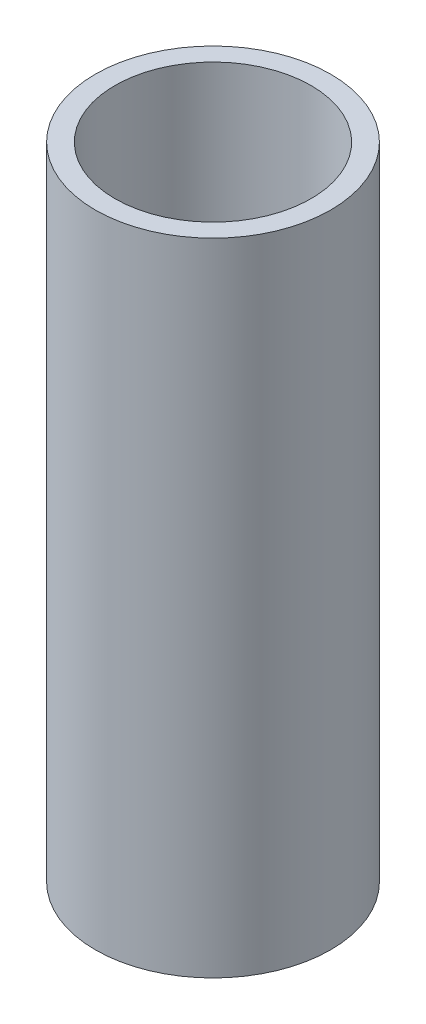
ISO-10303-21;
HEADER;
FILE_DESCRIPTION(('STEP AP214'),'2;1');
FILE_NAME('part.step','',(''),(''),'','','');
FILE_SCHEMA(('AUTOMOTIVE_DESIGN { 1 0 10303 214 1 1 1 1 }'));
ENDSEC;
DATA;
#1=APPLICATION_CONTEXT('core data for automotive mechanical design processes');
#2=APPLICATION_PROTOCOL_DEFINITION('international standard','automotive_design',2000,#1);
#3=PRODUCT_CONTEXT('',#1,'mechanical');
#4=PRODUCT('Part','Part','',(#3));
#5=PRODUCT_RELATED_PRODUCT_CATEGORY('part','',(#4));
#6=PRODUCT_DEFINITION_FORMATION('','',#4);
#7=PRODUCT_DEFINITION_CONTEXT('part definition',#1,'design');
#8=PRODUCT_DEFINITION('design','',#6,#7);
#9=PRODUCT_DEFINITION_SHAPE('','',#8);
#10=(LENGTH_UNIT() NAMED_UNIT(*) SI_UNIT(.MILLI.,.METRE.));
#11=(NAMED_UNIT(*) PLANE_ANGLE_UNIT() SI_UNIT($,.RADIAN.));
#12=(NAMED_UNIT(*) SI_UNIT($,.STERADIAN.) SOLID_ANGLE_UNIT());
#13=UNCERTAINTY_MEASURE_WITH_UNIT(LENGTH_MEASURE(1.E-05),#10,'distance_accuracy_value','');
#14=(GEOMETRIC_REPRESENTATION_CONTEXT(3) GLOBAL_UNCERTAINTY_ASSIGNED_CONTEXT((#13)) GLOBAL_UNIT_ASSIGNED_CONTEXT((#10,
#11,#12)) REPRESENTATION_CONTEXT('',''));
#15=CARTESIAN_POINT('',(0.,0.,0.));
#16=DIRECTION('',(0.,0.,1.));
#17=DIRECTION('',(1.,0.,0.));
#18=AXIS2_PLACEMENT_3D('',#15,#16,#17);
#19=CARTESIAN_POINT('',(0.,49.,0.));
#20=DIRECTION('',(0.,-1.,0.));
#21=DIRECTION('',(0.,0.,-1.));
#22=AXIS2_PLACEMENT_3D('',#19,#20,#21);
#23=CYLINDRICAL_SURFACE('',#22,9.);
#24=CARTESIAN_POINT('',(0.,49.,0.));
#25=DIRECTION('',(0.,1.,0.));
#26=DIRECTION('',(0.,0.,1.));
#27=AXIS2_PLACEMENT_3D('',#24,#25,#26);
#28=CIRCLE('',#27,9.);
#29=CARTESIAN_POINT('',(0.,49.,9.));
#30=VERTEX_POINT('',#29);
#31=EDGE_CURVE('E10',#30,#30,#28,.T.);
#32=ORIENTED_EDGE('',*,*,#31,.F.);
#33=EDGE_LOOP('',(#32));
#34=FACE_BOUND('',#33,.T.);
#35=CARTESIAN_POINT('',(0.,0.,0.));
#36=DIRECTION('',(0.,1.,0.));
#37=DIRECTION('',(0.,0.,1.));
#38=AXIS2_PLACEMENT_3D('',#35,#36,#37);
#39=CIRCLE('',#38,9.);
#40=CARTESIAN_POINT('',(0.,0.,9.));
#41=VERTEX_POINT('',#40);
#42=EDGE_CURVE('E34',#41,#41,#39,.T.);
#43=ORIENTED_EDGE('',*,*,#42,.T.);
#44=EDGE_LOOP('',(#43));
#45=FACE_BOUND('',#44,.T.);
#46=ADVANCED_FACE('F31',(#34,#45),#23,.T.);
#47=CARTESIAN_POINT('',(0.,49.,0.));
#48=DIRECTION('',(0.,1.,0.));
#49=DIRECTION('',(0.,0.,1.));
#50=AXIS2_PLACEMENT_3D('',#47,#48,#49);
#51=PLANE('',#50);
#52=CARTESIAN_POINT('',(0.,49.,0.));
#53=DIRECTION('',(0.,1.,0.));
#54=DIRECTION('',(0.,0.,1.));
#55=AXIS2_PLACEMENT_3D('',#52,#53,#54);
#56=CIRCLE('',#55,7.5);
#57=CARTESIAN_POINT('',(0.,49.,7.5));
#58=VERTEX_POINT('',#57);
#59=EDGE_CURVE('E43',#58,#58,#56,.T.);
#60=ORIENTED_EDGE('',*,*,#59,.F.);
#61=EDGE_LOOP('',(#60));
#62=FACE_BOUND('',#61,.T.);
#63=ORIENTED_EDGE('',*,*,#31,.T.);
#64=EDGE_LOOP('',(#63));
#65=FACE_BOUND('',#64,.T.);
#66=ADVANCED_FACE('F58',(#62,#65),#51,.T.);
#67=CARTESIAN_POINT('',(0.,0.,0.));
#68=DIRECTION('',(0.,1.,0.));
#69=DIRECTION('',(0.,0.,1.));
#70=AXIS2_PLACEMENT_3D('',#67,#68,#69);
#71=PLANE('',#70);
#72=ORIENTED_EDGE('',*,*,#42,.F.);
#73=EDGE_LOOP('',(#72));
#74=FACE_BOUND('',#73,.T.);
#75=ADVANCED_FACE('F54',(#74),#71,.F.);
#76=CARTESIAN_POINT('',(0.,2.,0.));
#77=DIRECTION('',(0.,1.,0.));
#78=DIRECTION('',(0.,0.,1.));
#79=AXIS2_PLACEMENT_3D('',#76,#77,#78);
#80=CYLINDRICAL_SURFACE('',#79,7.5);
#81=CARTESIAN_POINT('',(0.,2.,0.));
#82=DIRECTION('',(0.,1.,0.));
#83=DIRECTION('',(0.,0.,1.));
#84=AXIS2_PLACEMENT_3D('',#81,#82,#83);
#85=CIRCLE('',#84,7.5);
#86=CARTESIAN_POINT('',(0.,2.,7.5));
#87=VERTEX_POINT('',#86);
#88=EDGE_CURVE('E41',#87,#87,#85,.T.);
#89=ORIENTED_EDGE('',*,*,#88,.F.);
#90=EDGE_LOOP('',(#89));
#91=FACE_BOUND('',#90,.T.);
#92=ORIENTED_EDGE('',*,*,#59,.T.);
#93=EDGE_LOOP('',(#92));
#94=FACE_BOUND('',#93,.T.);
#95=ADVANCED_FACE('F51',(#91,#94),#80,.F.);
#96=CARTESIAN_POINT('',(0.,2.,0.));
#97=DIRECTION('',(0.,1.,0.));
#98=DIRECTION('',(0.,0.,1.));
#99=AXIS2_PLACEMENT_3D('',#96,#97,#98);
#100=PLANE('',#99);
#101=ORIENTED_EDGE('',*,*,#88,.T.);
#102=EDGE_LOOP('',(#101));
#103=FACE_BOUND('',#102,.T.);
#104=ADVANCED_FACE('F49',(#103),#100,.T.);
#105=CLOSED_SHELL('',(#46,#66,#75,#95,#104));
#106=MANIFOLD_SOLID_BREP('B2',#105);
#107=ADVANCED_BREP_SHAPE_REPRESENTATION('',(#18,#106),#14);
#108=SHAPE_DEFINITION_REPRESENTATION(#9,#107);
ENDSEC;
END-ISO-10303-21;
